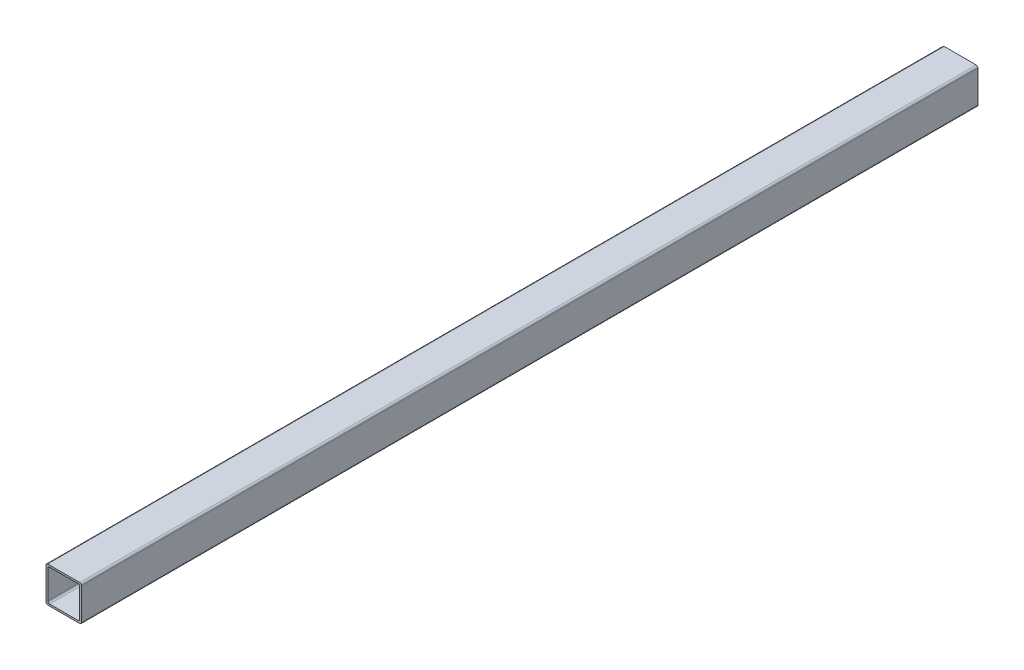
ISO-10303-21;
HEADER;
FILE_DESCRIPTION(('STEP AP214'),'2;1');
FILE_NAME('part.step','',(''),(''),'','','');
FILE_SCHEMA(('AUTOMOTIVE_DESIGN { 1 0 10303 214 1 1 1 1 }'));
ENDSEC;
DATA;
#1=APPLICATION_CONTEXT('core data for automotive mechanical design processes');
#2=APPLICATION_PROTOCOL_DEFINITION('international standard','automotive_design',2000,#1);
#3=PRODUCT_CONTEXT('',#1,'mechanical');
#4=PRODUCT('Part','Part','',(#3));
#5=PRODUCT_RELATED_PRODUCT_CATEGORY('part','',(#4));
#6=PRODUCT_DEFINITION_FORMATION('','',#4);
#7=PRODUCT_DEFINITION_CONTEXT('part definition',#1,'design');
#8=PRODUCT_DEFINITION('design','',#6,#7);
#9=PRODUCT_DEFINITION_SHAPE('','',#8);
#10=(LENGTH_UNIT() NAMED_UNIT(*) SI_UNIT(.MILLI.,.METRE.));
#11=(NAMED_UNIT(*) PLANE_ANGLE_UNIT() SI_UNIT($,.RADIAN.));
#12=(NAMED_UNIT(*) SI_UNIT($,.STERADIAN.) SOLID_ANGLE_UNIT());
#13=UNCERTAINTY_MEASURE_WITH_UNIT(LENGTH_MEASURE(1.E-05),#10,'distance_accuracy_value','');
#14=(GEOMETRIC_REPRESENTATION_CONTEXT(3) GLOBAL_UNCERTAINTY_ASSIGNED_CONTEXT((#13)) GLOBAL_UNIT_ASSIGNED_CONTEXT((#10,
#11,#12)) REPRESENTATION_CONTEXT('',''));
#15=CARTESIAN_POINT('',(0.,0.,0.));
#16=DIRECTION('',(0.,0.,1.));
#17=DIRECTION('',(1.,0.,0.));
#18=AXIS2_PLACEMENT_3D('',#15,#16,#17);
#19=CARTESIAN_POINT('',(18.,18.,1010.));
#20=DIRECTION('',(0.,0.,1.));
#21=DIRECTION('',(1.,0.,0.));
#22=AXIS2_PLACEMENT_3D('',#19,#20,#21);
#23=PLANE('',#22);
#24=CARTESIAN_POINT('',(18.,18.,1010.));
#25=DIRECTION('',(0.,0.,1.));
#26=DIRECTION('',(1.,0.,0.));
#27=AXIS2_PLACEMENT_3D('',#24,#25,#26);
#28=CIRCLE('',#27,2.);
#29=CARTESIAN_POINT('',(20.,18.,1010.));
#30=VERTEX_POINT('',#29);
#31=CARTESIAN_POINT('',(18.,20.,1010.));
#32=VERTEX_POINT('',#31);
#33=EDGE_CURVE('E213',#30,#32,#28,.T.);
#34=ORIENTED_EDGE('',*,*,#33,.T.);
#35=DIRECTION('',(-1.,0.,0.));
#36=VECTOR('',#35,1.);
#37=CARTESIAN_POINT('',(18.,20.,1010.));
#38=LINE('',#37,#36);
#39=CARTESIAN_POINT('',(-18.,20.,1010.));
#40=VERTEX_POINT('',#39);
#41=EDGE_CURVE('E216',#32,#40,#38,.T.);
#42=ORIENTED_EDGE('',*,*,#41,.T.);
#43=CARTESIAN_POINT('',(-18.,18.,1010.));
#44=DIRECTION('',(0.,0.,1.));
#45=DIRECTION('',(1.,0.,0.));
#46=AXIS2_PLACEMENT_3D('',#43,#44,#45);
#47=CIRCLE('',#46,2.);
#48=CARTESIAN_POINT('',(-20.,18.,1010.));
#49=VERTEX_POINT('',#48);
#50=EDGE_CURVE('E219',#40,#49,#47,.T.);
#51=ORIENTED_EDGE('',*,*,#50,.T.);
#52=DIRECTION('',(0.,-1.,0.));
#53=VECTOR('',#52,1.);
#54=CARTESIAN_POINT('',(-20.,-18.,1010.));
#55=LINE('',#54,#53);
#56=CARTESIAN_POINT('',(-20.,-18.,1010.));
#57=VERTEX_POINT('',#56);
#58=EDGE_CURVE('E221',#49,#57,#55,.T.);
#59=ORIENTED_EDGE('',*,*,#58,.T.);
#60=CARTESIAN_POINT('',(-18.,-18.,1010.));
#61=DIRECTION('',(0.,0.,1.));
#62=DIRECTION('',(-1.,0.,0.));
#63=AXIS2_PLACEMENT_3D('',#60,#61,#62);
#64=CIRCLE('',#63,2.);
#65=CARTESIAN_POINT('',(-18.,-20.,1010.));
#66=VERTEX_POINT('',#65);
#67=EDGE_CURVE('E223',#57,#66,#64,.T.);
#68=ORIENTED_EDGE('',*,*,#67,.T.);
#69=DIRECTION('',(1.,0.,0.));
#70=VECTOR('',#69,1.);
#71=CARTESIAN_POINT('',(18.,-20.,1010.));
#72=LINE('',#71,#70);
#73=CARTESIAN_POINT('',(18.,-20.,1010.));
#74=VERTEX_POINT('',#73);
#75=EDGE_CURVE('E225',#66,#74,#72,.T.);
#76=ORIENTED_EDGE('',*,*,#75,.T.);
#77=CARTESIAN_POINT('',(18.,-18.,1010.));
#78=DIRECTION('',(0.,0.,1.));
#79=DIRECTION('',(1.,0.,0.));
#80=AXIS2_PLACEMENT_3D('',#77,#78,#79);
#81=CIRCLE('',#80,2.);
#82=CARTESIAN_POINT('',(20.,-18.,1010.));
#83=VERTEX_POINT('',#82);
#84=EDGE_CURVE('E227',#74,#83,#81,.T.);
#85=ORIENTED_EDGE('',*,*,#84,.T.);
#86=DIRECTION('',(0.,1.,0.));
#87=VECTOR('',#86,1.);
#88=CARTESIAN_POINT('',(20.,-18.,1010.));
#89=LINE('',#88,#87);
#90=EDGE_CURVE('E229',#83,#30,#89,.T.);
#91=ORIENTED_EDGE('',*,*,#90,.T.);
#92=EDGE_LOOP('',(#34,#42,#51,#59,#68,#76,#85,#91));
#93=FACE_BOUND('',#92,.T.);
#94=DIRECTION('',(-1.,0.,0.));
#95=VECTOR('',#94,1.);
#96=CARTESIAN_POINT('',(-16.,18.,1010.));
#97=LINE('',#96,#95);
#98=CARTESIAN_POINT('',(16.,18.,1010.));
#99=VERTEX_POINT('',#98);
#100=CARTESIAN_POINT('',(-16.,18.,1010.));
#101=VERTEX_POINT('',#100);
#102=EDGE_CURVE('E156',#99,#101,#97,.T.);
#103=ORIENTED_EDGE('',*,*,#102,.F.);
#104=CARTESIAN_POINT('',(16.,16.,1010.));
#105=DIRECTION('',(0.,0.,1.));
#106=DIRECTION('',(-1.,0.,0.));
#107=AXIS2_PLACEMENT_3D('',#104,#105,#106);
#108=CIRCLE('',#107,2.);
#109=CARTESIAN_POINT('',(18.,16.,1010.));
#110=VERTEX_POINT('',#109);
#111=EDGE_CURVE('E148',#110,#99,#108,.T.);
#112=ORIENTED_EDGE('',*,*,#111,.F.);
#113=DIRECTION('',(0.,1.,0.));
#114=VECTOR('',#113,1.);
#115=CARTESIAN_POINT('',(18.,16.,1010.));
#116=LINE('',#115,#114);
#117=CARTESIAN_POINT('',(18.,-16.,1010.));
#118=VERTEX_POINT('',#117);
#119=EDGE_CURVE('E181',#118,#110,#116,.T.);
#120=ORIENTED_EDGE('',*,*,#119,.F.);
#121=CARTESIAN_POINT('',(16.,-16.,1010.));
#122=DIRECTION('',(0.,0.,1.));
#123=DIRECTION('',(1.,0.,0.));
#124=AXIS2_PLACEMENT_3D('',#121,#122,#123);
#125=CIRCLE('',#124,2.);
#126=CARTESIAN_POINT('',(16.,-18.,1010.));
#127=VERTEX_POINT('',#126);
#128=EDGE_CURVE('E179',#127,#118,#125,.T.);
#129=ORIENTED_EDGE('',*,*,#128,.F.);
#130=DIRECTION('',(1.,0.,0.));
#131=VECTOR('',#130,1.);
#132=CARTESIAN_POINT('',(-16.,-18.,1010.));
#133=LINE('',#132,#131);
#134=CARTESIAN_POINT('',(-16.,-18.,1010.));
#135=VERTEX_POINT('',#134);
#136=EDGE_CURVE('E177',#135,#127,#133,.T.);
#137=ORIENTED_EDGE('',*,*,#136,.F.);
#138=CARTESIAN_POINT('',(-16.,-16.,1010.));
#139=DIRECTION('',(0.,0.,1.));
#140=DIRECTION('',(1.,0.,0.));
#141=AXIS2_PLACEMENT_3D('',#138,#139,#140);
#142=CIRCLE('',#141,2.);
#143=CARTESIAN_POINT('',(-18.,-16.,1010.));
#144=VERTEX_POINT('',#143);
#145=EDGE_CURVE('E175',#144,#135,#142,.T.);
#146=ORIENTED_EDGE('',*,*,#145,.F.);
#147=DIRECTION('',(0.,-1.,0.));
#148=VECTOR('',#147,1.);
#149=CARTESIAN_POINT('',(-18.,16.,1010.));
#150=LINE('',#149,#148);
#151=CARTESIAN_POINT('',(-18.,16.,1010.));
#152=VERTEX_POINT('',#151);
#153=EDGE_CURVE('E171',#152,#144,#150,.T.);
#154=ORIENTED_EDGE('',*,*,#153,.F.);
#155=CARTESIAN_POINT('',(-16.,16.,1010.));
#156=DIRECTION('',(0.,0.,1.));
#157=DIRECTION('',(1.,0.,0.));
#158=AXIS2_PLACEMENT_3D('',#155,#156,#157);
#159=CIRCLE('',#158,2.);
#160=EDGE_CURVE('E169',#101,#152,#159,.T.);
#161=ORIENTED_EDGE('',*,*,#160,.F.);
#162=EDGE_LOOP('',(#103,#112,#120,#129,#137,#146,#154,#161));
#163=FACE_BOUND('',#162,.T.);
#164=ADVANCED_FACE('F35',(#93,#163),#23,.T.);
#165=CARTESIAN_POINT('',(18.,18.,0.));
#166=DIRECTION('',(0.,0.,1.));
#167=DIRECTION('',(1.,0.,0.));
#168=AXIS2_PLACEMENT_3D('',#165,#166,#167);
#169=PLANE('',#168);
#170=CARTESIAN_POINT('',(18.,18.,0.));
#171=DIRECTION('',(0.,0.,1.));
#172=DIRECTION('',(1.,0.,0.));
#173=AXIS2_PLACEMENT_3D('',#170,#171,#172);
#174=CIRCLE('',#173,2.);
#175=CARTESIAN_POINT('',(20.,18.,0.));
#176=VERTEX_POINT('',#175);
#177=CARTESIAN_POINT('',(18.,20.,0.));
#178=VERTEX_POINT('',#177);
#179=EDGE_CURVE('E164',#176,#178,#174,.T.);
#180=ORIENTED_EDGE('',*,*,#179,.F.);
#181=DIRECTION('',(0.,1.,0.));
#182=VECTOR('',#181,1.);
#183=CARTESIAN_POINT('',(20.,-18.,0.));
#184=LINE('',#183,#182);
#185=CARTESIAN_POINT('',(20.,-18.,0.));
#186=VERTEX_POINT('',#185);
#187=EDGE_CURVE('E217',#186,#176,#184,.T.);
#188=ORIENTED_EDGE('',*,*,#187,.F.);
#189=CARTESIAN_POINT('',(18.,-18.,0.));
#190=DIRECTION('',(0.,0.,1.));
#191=DIRECTION('',(1.,0.,0.));
#192=AXIS2_PLACEMENT_3D('',#189,#190,#191);
#193=CIRCLE('',#192,2.);
#194=CARTESIAN_POINT('',(18.,-20.,0.));
#195=VERTEX_POINT('',#194);
#196=EDGE_CURVE('E244',#195,#186,#193,.T.);
#197=ORIENTED_EDGE('',*,*,#196,.F.);
#198=DIRECTION('',(1.,0.,0.));
#199=VECTOR('',#198,1.);
#200=CARTESIAN_POINT('',(18.,-20.,0.));
#201=LINE('',#200,#199);
#202=CARTESIAN_POINT('',(-18.,-20.,0.));
#203=VERTEX_POINT('',#202);
#204=EDGE_CURVE('E242',#203,#195,#201,.T.);
#205=ORIENTED_EDGE('',*,*,#204,.F.);
#206=CARTESIAN_POINT('',(-18.,-18.,0.));
#207=DIRECTION('',(0.,0.,1.));
#208=DIRECTION('',(-1.,0.,0.));
#209=AXIS2_PLACEMENT_3D('',#206,#207,#208);
#210=CIRCLE('',#209,2.);
#211=CARTESIAN_POINT('',(-20.,-18.,0.));
#212=VERTEX_POINT('',#211);
#213=EDGE_CURVE('E240',#212,#203,#210,.T.);
#214=ORIENTED_EDGE('',*,*,#213,.F.);
#215=DIRECTION('',(0.,-1.,0.));
#216=VECTOR('',#215,1.);
#217=CARTESIAN_POINT('',(-20.,-18.,0.));
#218=LINE('',#217,#216);
#219=CARTESIAN_POINT('',(-20.,18.,0.));
#220=VERTEX_POINT('',#219);
#221=EDGE_CURVE('E238',#220,#212,#218,.T.);
#222=ORIENTED_EDGE('',*,*,#221,.F.);
#223=CARTESIAN_POINT('',(-18.,18.,0.));
#224=DIRECTION('',(0.,0.,1.));
#225=DIRECTION('',(1.,0.,0.));
#226=AXIS2_PLACEMENT_3D('',#223,#224,#225);
#227=CIRCLE('',#226,2.);
#228=CARTESIAN_POINT('',(-18.,20.,0.));
#229=VERTEX_POINT('',#228);
#230=EDGE_CURVE('E236',#229,#220,#227,.T.);
#231=ORIENTED_EDGE('',*,*,#230,.F.);
#232=DIRECTION('',(-1.,0.,0.));
#233=VECTOR('',#232,1.);
#234=CARTESIAN_POINT('',(18.,20.,0.));
#235=LINE('',#234,#233);
#236=EDGE_CURVE('E234',#178,#229,#235,.T.);
#237=ORIENTED_EDGE('',*,*,#236,.F.);
#238=EDGE_LOOP('',(#180,#188,#197,#205,#214,#222,#231,#237));
#239=FACE_BOUND('',#238,.T.);
#240=CARTESIAN_POINT('',(16.,16.,0.));
#241=DIRECTION('',(0.,0.,1.));
#242=DIRECTION('',(-1.,0.,0.));
#243=AXIS2_PLACEMENT_3D('',#240,#241,#242);
#244=CIRCLE('',#243,2.);
#245=CARTESIAN_POINT('',(18.,16.,0.));
#246=VERTEX_POINT('',#245);
#247=CARTESIAN_POINT('',(16.,18.,0.));
#248=VERTEX_POINT('',#247);
#249=EDGE_CURVE('E58',#246,#248,#244,.T.);
#250=ORIENTED_EDGE('',*,*,#249,.T.);
#251=DIRECTION('',(-1.,0.,0.));
#252=VECTOR('',#251,1.);
#253=CARTESIAN_POINT('',(-16.,18.,0.));
#254=LINE('',#253,#252);
#255=CARTESIAN_POINT('',(-16.,18.,0.));
#256=VERTEX_POINT('',#255);
#257=EDGE_CURVE('E163',#248,#256,#254,.T.);
#258=ORIENTED_EDGE('',*,*,#257,.T.);
#259=CARTESIAN_POINT('',(-16.,16.,0.));
#260=DIRECTION('',(0.,0.,1.));
#261=DIRECTION('',(1.,0.,0.));
#262=AXIS2_PLACEMENT_3D('',#259,#260,#261);
#263=CIRCLE('',#262,2.);
#264=CARTESIAN_POINT('',(-18.,16.,0.));
#265=VERTEX_POINT('',#264);
#266=EDGE_CURVE('E185',#256,#265,#263,.T.);
#267=ORIENTED_EDGE('',*,*,#266,.T.);
#268=DIRECTION('',(0.,-1.,0.));
#269=VECTOR('',#268,1.);
#270=CARTESIAN_POINT('',(-18.,16.,0.));
#271=LINE('',#270,#269);
#272=CARTESIAN_POINT('',(-18.,-16.,0.));
#273=VERTEX_POINT('',#272);
#274=EDGE_CURVE('E188',#265,#273,#271,.T.);
#275=ORIENTED_EDGE('',*,*,#274,.T.);
#276=CARTESIAN_POINT('',(-16.,-16.,0.));
#277=DIRECTION('',(0.,0.,1.));
#278=DIRECTION('',(1.,0.,0.));
#279=AXIS2_PLACEMENT_3D('',#276,#277,#278);
#280=CIRCLE('',#279,2.);
#281=CARTESIAN_POINT('',(-16.,-18.,0.));
#282=VERTEX_POINT('',#281);
#283=EDGE_CURVE('E191',#273,#282,#280,.T.);
#284=ORIENTED_EDGE('',*,*,#283,.T.);
#285=DIRECTION('',(1.,0.,0.));
#286=VECTOR('',#285,1.);
#287=CARTESIAN_POINT('',(-16.,-18.,0.));
#288=LINE('',#287,#286);
#289=CARTESIAN_POINT('',(16.,-18.,0.));
#290=VERTEX_POINT('',#289);
#291=EDGE_CURVE('E194',#282,#290,#288,.T.);
#292=ORIENTED_EDGE('',*,*,#291,.T.);
#293=CARTESIAN_POINT('',(16.,-16.,0.));
#294=DIRECTION('',(0.,0.,1.));
#295=DIRECTION('',(1.,0.,0.));
#296=AXIS2_PLACEMENT_3D('',#293,#294,#295);
#297=CIRCLE('',#296,2.);
#298=CARTESIAN_POINT('',(18.,-16.,0.));
#299=VERTEX_POINT('',#298);
#300=EDGE_CURVE('E197',#290,#299,#297,.T.);
#301=ORIENTED_EDGE('',*,*,#300,.T.);
#302=DIRECTION('',(0.,1.,0.));
#303=VECTOR('',#302,1.);
#304=CARTESIAN_POINT('',(18.,16.,0.));
#305=LINE('',#304,#303);
#306=EDGE_CURVE('E157',#299,#246,#305,.T.);
#307=ORIENTED_EDGE('',*,*,#306,.T.);
#308=EDGE_LOOP('',(#250,#258,#267,#275,#284,#292,#301,#307));
#309=FACE_BOUND('',#308,.T.);
#310=ADVANCED_FACE('F274',(#239,#309),#169,.F.);
#311=CARTESIAN_POINT('',(18.,18.,1010.));
#312=DIRECTION('',(0.,0.,-1.));
#313=DIRECTION('',(-1.,0.,0.));
#314=AXIS2_PLACEMENT_3D('',#311,#312,#313);
#315=CYLINDRICAL_SURFACE('',#314,2.);
#316=ORIENTED_EDGE('',*,*,#179,.T.);
#317=DIRECTION('',(0.,0.,-1.));
#318=VECTOR('',#317,1.);
#319=CARTESIAN_POINT('',(18.,20.,1010.));
#320=LINE('',#319,#318);
#321=EDGE_CURVE('E11',#32,#178,#320,.T.);
#322=ORIENTED_EDGE('',*,*,#321,.F.);
#323=ORIENTED_EDGE('',*,*,#33,.F.);
#324=DIRECTION('',(0.,0.,-1.));
#325=VECTOR('',#324,1.);
#326=CARTESIAN_POINT('',(20.,18.,1010.));
#327=LINE('',#326,#325);
#328=EDGE_CURVE('E231',#30,#176,#327,.T.);
#329=ORIENTED_EDGE('',*,*,#328,.T.);
#330=EDGE_LOOP('',(#316,#322,#323,#329));
#331=FACE_BOUND('',#330,.T.);
#332=ADVANCED_FACE('F37',(#331),#315,.T.);
#333=CARTESIAN_POINT('',(18.,20.,1010.));
#334=DIRECTION('',(0.,-1.,0.));
#335=DIRECTION('',(1.,0.,0.));
#336=AXIS2_PLACEMENT_3D('',#333,#334,#335);
#337=PLANE('',#336);
#338=ORIENTED_EDGE('',*,*,#236,.T.);
#339=DIRECTION('',(0.,0.,-1.));
#340=VECTOR('',#339,1.);
#341=CARTESIAN_POINT('',(-18.,20.,1010.));
#342=LINE('',#341,#340);
#343=EDGE_CURVE('E43',#40,#229,#342,.T.);
#344=ORIENTED_EDGE('',*,*,#343,.F.);
#345=ORIENTED_EDGE('',*,*,#41,.F.);
#346=ORIENTED_EDGE('',*,*,#321,.T.);
#347=EDGE_LOOP('',(#338,#344,#345,#346));
#348=FACE_BOUND('',#347,.T.);
#349=ADVANCED_FACE('F291',(#348),#337,.F.);
#350=CARTESIAN_POINT('',(-18.,18.,1010.));
#351=DIRECTION('',(0.,0.,-1.));
#352=DIRECTION('',(-1.,0.,0.));
#353=AXIS2_PLACEMENT_3D('',#350,#351,#352);
#354=CYLINDRICAL_SURFACE('',#353,2.);
#355=ORIENTED_EDGE('',*,*,#230,.T.);
#356=DIRECTION('',(0.,0.,-1.));
#357=VECTOR('',#356,1.);
#358=CARTESIAN_POINT('',(-20.,18.,1010.));
#359=LINE('',#358,#357);
#360=EDGE_CURVE('E261',#49,#220,#359,.T.);
#361=ORIENTED_EDGE('',*,*,#360,.F.);
#362=ORIENTED_EDGE('',*,*,#50,.F.);
#363=ORIENTED_EDGE('',*,*,#343,.T.);
#364=EDGE_LOOP('',(#355,#361,#362,#363));
#365=FACE_BOUND('',#364,.T.);
#366=ADVANCED_FACE('F268',(#365),#354,.T.);
#367=CARTESIAN_POINT('',(-20.,-18.,1010.));
#368=DIRECTION('',(1.,0.,0.));
#369=DIRECTION('',(0.,0.,-1.));
#370=AXIS2_PLACEMENT_3D('',#367,#368,#369);
#371=PLANE('',#370);
#372=ORIENTED_EDGE('',*,*,#221,.T.);
#373=DIRECTION('',(0.,0.,-1.));
#374=VECTOR('',#373,1.);
#375=CARTESIAN_POINT('',(-20.,-18.,1010.));
#376=LINE('',#375,#374);
#377=EDGE_CURVE('E258',#57,#212,#376,.T.);
#378=ORIENTED_EDGE('',*,*,#377,.F.);
#379=ORIENTED_EDGE('',*,*,#58,.F.);
#380=ORIENTED_EDGE('',*,*,#360,.T.);
#381=EDGE_LOOP('',(#372,#378,#379,#380));
#382=FACE_BOUND('',#381,.T.);
#383=ADVANCED_FACE('F280',(#382),#371,.F.);
#384=CARTESIAN_POINT('',(-18.,-18.,1010.));
#385=DIRECTION('',(0.,0.,-1.));
#386=DIRECTION('',(-1.,0.,0.));
#387=AXIS2_PLACEMENT_3D('',#384,#385,#386);
#388=CYLINDRICAL_SURFACE('',#387,2.);
#389=ORIENTED_EDGE('',*,*,#213,.T.);
#390=DIRECTION('',(0.,0.,-1.));
#391=VECTOR('',#390,1.);
#392=CARTESIAN_POINT('',(-18.,-20.,1010.));
#393=LINE('',#392,#391);
#394=EDGE_CURVE('E255',#66,#203,#393,.T.);
#395=ORIENTED_EDGE('',*,*,#394,.F.);
#396=ORIENTED_EDGE('',*,*,#67,.F.);
#397=ORIENTED_EDGE('',*,*,#377,.T.);
#398=EDGE_LOOP('',(#389,#395,#396,#397));
#399=FACE_BOUND('',#398,.T.);
#400=ADVANCED_FACE('F284',(#399),#388,.T.);
#401=CARTESIAN_POINT('',(18.,-20.,1010.));
#402=DIRECTION('',(0.,1.,0.));
#403=DIRECTION('',(-1.,0.,0.));
#404=AXIS2_PLACEMENT_3D('',#401,#402,#403);
#405=PLANE('',#404);
#406=ORIENTED_EDGE('',*,*,#204,.T.);
#407=DIRECTION('',(0.,0.,-1.));
#408=VECTOR('',#407,1.);
#409=CARTESIAN_POINT('',(18.,-20.,1010.));
#410=LINE('',#409,#408);
#411=EDGE_CURVE('E252',#74,#195,#410,.T.);
#412=ORIENTED_EDGE('',*,*,#411,.F.);
#413=ORIENTED_EDGE('',*,*,#75,.F.);
#414=ORIENTED_EDGE('',*,*,#394,.T.);
#415=EDGE_LOOP('',(#406,#412,#413,#414));
#416=FACE_BOUND('',#415,.T.);
#417=ADVANCED_FACE('F304',(#416),#405,.F.);
#418=CARTESIAN_POINT('',(18.,-18.,1010.));
#419=DIRECTION('',(0.,0.,-1.));
#420=DIRECTION('',(-1.,0.,0.));
#421=AXIS2_PLACEMENT_3D('',#418,#419,#420);
#422=CYLINDRICAL_SURFACE('',#421,2.);
#423=ORIENTED_EDGE('',*,*,#196,.T.);
#424=DIRECTION('',(0.,0.,-1.));
#425=VECTOR('',#424,1.);
#426=CARTESIAN_POINT('',(20.,-18.,1010.));
#427=LINE('',#426,#425);
#428=EDGE_CURVE('E249',#83,#186,#427,.T.);
#429=ORIENTED_EDGE('',*,*,#428,.F.);
#430=ORIENTED_EDGE('',*,*,#84,.F.);
#431=ORIENTED_EDGE('',*,*,#411,.T.);
#432=EDGE_LOOP('',(#423,#429,#430,#431));
#433=FACE_BOUND('',#432,.T.);
#434=ADVANCED_FACE('F302',(#433),#422,.T.);
#435=CARTESIAN_POINT('',(20.,-18.,1010.));
#436=DIRECTION('',(-1.,0.,0.));
#437=DIRECTION('',(0.,0.,1.));
#438=AXIS2_PLACEMENT_3D('',#435,#436,#437);
#439=PLANE('',#438);
#440=ORIENTED_EDGE('',*,*,#187,.T.);
#441=ORIENTED_EDGE('',*,*,#328,.F.);
#442=ORIENTED_EDGE('',*,*,#90,.F.);
#443=ORIENTED_EDGE('',*,*,#428,.T.);
#444=EDGE_LOOP('',(#440,#441,#442,#443));
#445=FACE_BOUND('',#444,.T.);
#446=ADVANCED_FACE('F297',(#445),#439,.F.);
#447=CARTESIAN_POINT('',(16.,16.,1010.));
#448=DIRECTION('',(0.,0.,-1.));
#449=DIRECTION('',(-1.,0.,0.));
#450=AXIS2_PLACEMENT_3D('',#447,#448,#449);
#451=CYLINDRICAL_SURFACE('',#450,2.);
#452=ORIENTED_EDGE('',*,*,#249,.F.);
#453=DIRECTION('',(0.,0.,-1.));
#454=VECTOR('',#453,1.);
#455=CARTESIAN_POINT('',(18.,16.,1010.));
#456=LINE('',#455,#454);
#457=EDGE_CURVE('E152',#110,#246,#456,.T.);
#458=ORIENTED_EDGE('',*,*,#457,.F.);
#459=ORIENTED_EDGE('',*,*,#111,.T.);
#460=DIRECTION('',(0.,0.,-1.));
#461=VECTOR('',#460,1.);
#462=CARTESIAN_POINT('',(16.,18.,1010.));
#463=LINE('',#462,#461);
#464=EDGE_CURVE('E151',#99,#248,#463,.T.);
#465=ORIENTED_EDGE('',*,*,#464,.T.);
#466=EDGE_LOOP('',(#452,#458,#459,#465));
#467=FACE_BOUND('',#466,.T.);
#468=ADVANCED_FACE('F150',(#467),#451,.F.);
#469=CARTESIAN_POINT('',(-16.,18.,1010.));
#470=DIRECTION('',(0.,-1.,0.));
#471=DIRECTION('',(0.,0.,-1.));
#472=AXIS2_PLACEMENT_3D('',#469,#470,#471);
#473=PLANE('',#472);
#474=ORIENTED_EDGE('',*,*,#257,.F.);
#475=ORIENTED_EDGE('',*,*,#464,.F.);
#476=ORIENTED_EDGE('',*,*,#102,.T.);
#477=DIRECTION('',(0.,0.,-1.));
#478=VECTOR('',#477,1.);
#479=CARTESIAN_POINT('',(-16.,18.,1010.));
#480=LINE('',#479,#478);
#481=EDGE_CURVE('E165',#101,#256,#480,.T.);
#482=ORIENTED_EDGE('',*,*,#481,.T.);
#483=EDGE_LOOP('',(#474,#475,#476,#482));
#484=FACE_BOUND('',#483,.T.);
#485=ADVANCED_FACE('F160',(#484),#473,.T.);
#486=CARTESIAN_POINT('',(-16.,16.,1010.));
#487=DIRECTION('',(0.,0.,-1.));
#488=DIRECTION('',(-1.,0.,0.));
#489=AXIS2_PLACEMENT_3D('',#486,#487,#488);
#490=CYLINDRICAL_SURFACE('',#489,2.);
#491=ORIENTED_EDGE('',*,*,#266,.F.);
#492=ORIENTED_EDGE('',*,*,#481,.F.);
#493=ORIENTED_EDGE('',*,*,#160,.T.);
#494=DIRECTION('',(0.,0.,-1.));
#495=VECTOR('',#494,1.);
#496=CARTESIAN_POINT('',(-18.,16.,1010.));
#497=LINE('',#496,#495);
#498=EDGE_CURVE('E210',#152,#265,#497,.T.);
#499=ORIENTED_EDGE('',*,*,#498,.T.);
#500=EDGE_LOOP('',(#491,#492,#493,#499));
#501=FACE_BOUND('',#500,.T.);
#502=ADVANCED_FACE('F329',(#501),#490,.F.);
#503=CARTESIAN_POINT('',(-18.,16.,1010.));
#504=DIRECTION('',(1.,0.,0.));
#505=DIRECTION('',(0.,1.,0.));
#506=AXIS2_PLACEMENT_3D('',#503,#504,#505);
#507=PLANE('',#506);
#508=ORIENTED_EDGE('',*,*,#274,.F.);
#509=ORIENTED_EDGE('',*,*,#498,.F.);
#510=ORIENTED_EDGE('',*,*,#153,.T.);
#511=DIRECTION('',(0.,0.,-1.));
#512=VECTOR('',#511,1.);
#513=CARTESIAN_POINT('',(-18.,-16.,1010.));
#514=LINE('',#513,#512);
#515=EDGE_CURVE('E208',#144,#273,#514,.T.);
#516=ORIENTED_EDGE('',*,*,#515,.T.);
#517=EDGE_LOOP('',(#508,#509,#510,#516));
#518=FACE_BOUND('',#517,.T.);
#519=ADVANCED_FACE('F333',(#518),#507,.T.);
#520=CARTESIAN_POINT('',(-16.,-16.,1010.));
#521=DIRECTION('',(0.,0.,-1.));
#522=DIRECTION('',(-1.,0.,0.));
#523=AXIS2_PLACEMENT_3D('',#520,#521,#522);
#524=CYLINDRICAL_SURFACE('',#523,2.);
#525=ORIENTED_EDGE('',*,*,#283,.F.);
#526=ORIENTED_EDGE('',*,*,#515,.F.);
#527=ORIENTED_EDGE('',*,*,#145,.T.);
#528=DIRECTION('',(0.,0.,-1.));
#529=VECTOR('',#528,1.);
#530=CARTESIAN_POINT('',(-16.,-18.,1010.));
#531=LINE('',#530,#529);
#532=EDGE_CURVE('E206',#135,#282,#531,.T.);
#533=ORIENTED_EDGE('',*,*,#532,.T.);
#534=EDGE_LOOP('',(#525,#526,#527,#533));
#535=FACE_BOUND('',#534,.T.);
#536=ADVANCED_FACE('F339',(#535),#524,.F.);
#537=CARTESIAN_POINT('',(-16.,-18.,1010.));
#538=DIRECTION('',(0.,1.,0.));
#539=DIRECTION('',(0.,0.,1.));
#540=AXIS2_PLACEMENT_3D('',#537,#538,#539);
#541=PLANE('',#540);
#542=ORIENTED_EDGE('',*,*,#291,.F.);
#543=ORIENTED_EDGE('',*,*,#532,.F.);
#544=ORIENTED_EDGE('',*,*,#136,.T.);
#545=DIRECTION('',(0.,0.,-1.));
#546=VECTOR('',#545,1.);
#547=CARTESIAN_POINT('',(16.,-18.,1010.));
#548=LINE('',#547,#546);
#549=EDGE_CURVE('E204',#127,#290,#548,.T.);
#550=ORIENTED_EDGE('',*,*,#549,.T.);
#551=EDGE_LOOP('',(#542,#543,#544,#550));
#552=FACE_BOUND('',#551,.T.);
#553=ADVANCED_FACE('F343',(#552),#541,.T.);
#554=CARTESIAN_POINT('',(16.,-16.,1010.));
#555=DIRECTION('',(0.,0.,-1.));
#556=DIRECTION('',(-1.,0.,0.));
#557=AXIS2_PLACEMENT_3D('',#554,#555,#556);
#558=CYLINDRICAL_SURFACE('',#557,2.);
#559=ORIENTED_EDGE('',*,*,#300,.F.);
#560=ORIENTED_EDGE('',*,*,#549,.F.);
#561=ORIENTED_EDGE('',*,*,#128,.T.);
#562=DIRECTION('',(0.,0.,-1.));
#563=VECTOR('',#562,1.);
#564=CARTESIAN_POINT('',(18.,-16.,1010.));
#565=LINE('',#564,#563);
#566=EDGE_CURVE('E50',#118,#299,#565,.T.);
#567=ORIENTED_EDGE('',*,*,#566,.T.);
#568=EDGE_LOOP('',(#559,#560,#561,#567));
#569=FACE_BOUND('',#568,.T.);
#570=ADVANCED_FACE('F347',(#569),#558,.F.);
#571=CARTESIAN_POINT('',(18.,16.,1010.));
#572=DIRECTION('',(-1.,0.,0.));
#573=DIRECTION('',(0.,-1.,0.));
#574=AXIS2_PLACEMENT_3D('',#571,#572,#573);
#575=PLANE('',#574);
#576=ORIENTED_EDGE('',*,*,#306,.F.);
#577=ORIENTED_EDGE('',*,*,#566,.F.);
#578=ORIENTED_EDGE('',*,*,#119,.T.);
#579=ORIENTED_EDGE('',*,*,#457,.T.);
#580=EDGE_LOOP('',(#576,#577,#578,#579));
#581=FACE_BOUND('',#580,.T.);
#582=ADVANCED_FACE('F351',(#581),#575,.T.);
#583=CLOSED_SHELL('',(#164,#310,#332,#349,#366,#383,#400,#417,#434,#446,#468,#485,#502,#519,
#536,#553,#570,#582));
#584=MANIFOLD_SOLID_BREP('B2',#583);
#585=ADVANCED_BREP_SHAPE_REPRESENTATION('',(#18,#584),#14);
#586=SHAPE_DEFINITION_REPRESENTATION(#9,#585);
ENDSEC;
END-ISO-10303-21;
